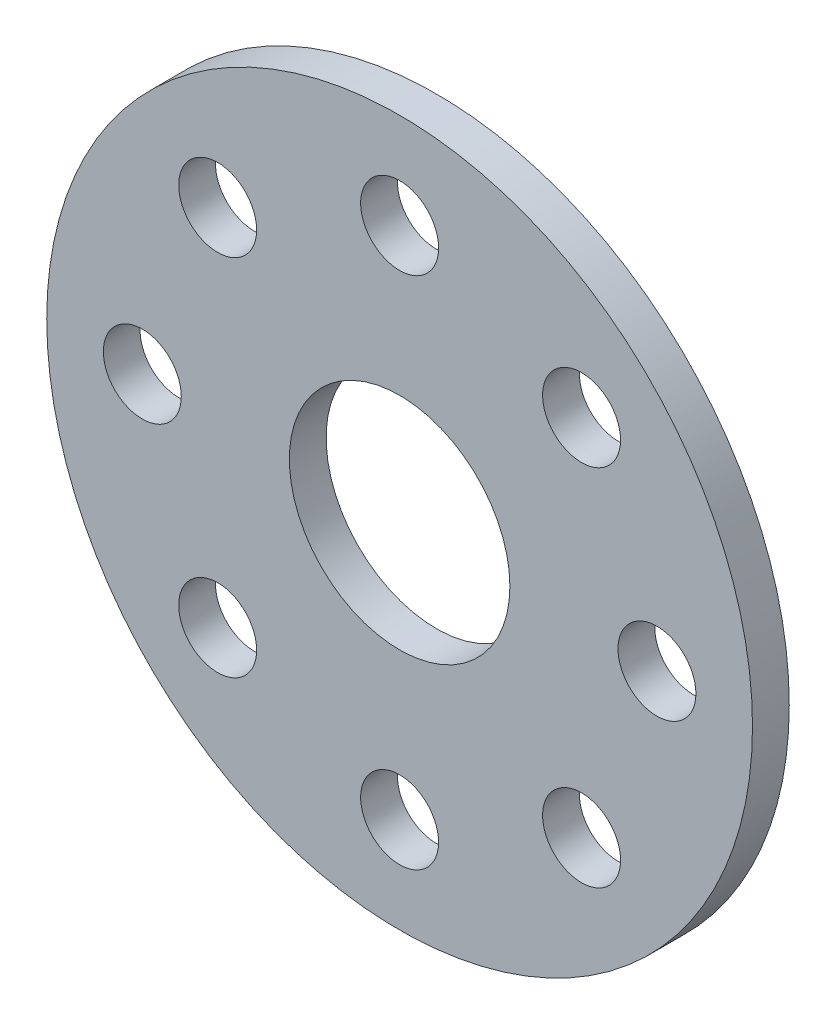
ISO-10303-21;
HEADER;
FILE_DESCRIPTION(('STEP AP214'),'2;1');
FILE_NAME('part.step','',(''),(''),'','','');
FILE_SCHEMA(('AUTOMOTIVE_DESIGN { 1 0 10303 214 1 1 1 1 }'));
ENDSEC;
DATA;
#1=APPLICATION_CONTEXT('core data for automotive mechanical design processes');
#2=APPLICATION_PROTOCOL_DEFINITION('international standard','automotive_design',2000,#1);
#3=PRODUCT_CONTEXT('',#1,'mechanical');
#4=PRODUCT('Part','Part','',(#3));
#5=PRODUCT_RELATED_PRODUCT_CATEGORY('part','',(#4));
#6=PRODUCT_DEFINITION_FORMATION('','',#4);
#7=PRODUCT_DEFINITION_CONTEXT('part definition',#1,'design');
#8=PRODUCT_DEFINITION('design','',#6,#7);
#9=PRODUCT_DEFINITION_SHAPE('','',#8);
#10=(LENGTH_UNIT() NAMED_UNIT(*) SI_UNIT(.MILLI.,.METRE.));
#11=(NAMED_UNIT(*) PLANE_ANGLE_UNIT() SI_UNIT($,.RADIAN.));
#12=(NAMED_UNIT(*) SI_UNIT($,.STERADIAN.) SOLID_ANGLE_UNIT());
#13=UNCERTAINTY_MEASURE_WITH_UNIT(LENGTH_MEASURE(1.E-05),#10,'distance_accuracy_value','');
#14=(GEOMETRIC_REPRESENTATION_CONTEXT(3) GLOBAL_UNCERTAINTY_ASSIGNED_CONTEXT((#13)) GLOBAL_UNIT_ASSIGNED_CONTEXT((#10,
#11,#12)) REPRESENTATION_CONTEXT('',''));
#15=CARTESIAN_POINT('',(0.,0.,0.));
#16=DIRECTION('',(0.,0.,1.));
#17=DIRECTION('',(1.,0.,0.));
#18=AXIS2_PLACEMENT_3D('',#15,#16,#17);
#19=CARTESIAN_POINT('',(0.,0.,1.25));
#20=DIRECTION('',(0.,0.,1.));
#21=DIRECTION('',(1.,0.,0.));
#22=AXIS2_PLACEMENT_3D('',#19,#20,#21);
#23=PLANE('',#22);
#24=CARTESIAN_POINT('',(0.,-17.5,1.25));
#25=DIRECTION('',(0.,0.,1.));
#26=DIRECTION('',(1.,0.,0.));
#27=AXIS2_PLACEMENT_3D('',#24,#25,#26);
#28=CIRCLE('',#27,2.65);
#29=CARTESIAN_POINT('',(2.65,-17.5,1.25));
#30=VERTEX_POINT('',#29);
#31=EDGE_CURVE('E93',#30,#30,#28,.T.);
#32=ORIENTED_EDGE('',*,*,#31,.F.);
#33=EDGE_LOOP('',(#32));
#34=FACE_BOUND('',#33,.T.);
#35=CARTESIAN_POINT('',(-12.3743686707646,-12.3743686707646,1.25));
#36=DIRECTION('',(0.,0.,1.));
#37=DIRECTION('',(1.,0.,0.));
#38=AXIS2_PLACEMENT_3D('',#35,#36,#37);
#39=CIRCLE('',#38,2.65);
#40=CARTESIAN_POINT('',(-9.72436867076459,-12.3743686707646,1.25));
#41=VERTEX_POINT('',#40);
#42=EDGE_CURVE('E87',#41,#41,#39,.T.);
#43=ORIENTED_EDGE('',*,*,#42,.F.);
#44=EDGE_LOOP('',(#43));
#45=FACE_BOUND('',#44,.T.);
#46=CARTESIAN_POINT('',(-17.5,0.,1.25));
#47=DIRECTION('',(0.,0.,1.));
#48=DIRECTION('',(1.,0.,0.));
#49=AXIS2_PLACEMENT_3D('',#46,#47,#48);
#50=CIRCLE('',#49,2.65);
#51=CARTESIAN_POINT('',(-14.85,0.,1.25));
#52=VERTEX_POINT('',#51);
#53=EDGE_CURVE('E81',#52,#52,#50,.T.);
#54=ORIENTED_EDGE('',*,*,#53,.F.);
#55=EDGE_LOOP('',(#54));
#56=FACE_BOUND('',#55,.T.);
#57=CARTESIAN_POINT('',(-12.3743686707646,12.3743686707646,1.25));
#58=DIRECTION('',(0.,0.,1.));
#59=DIRECTION('',(1.,0.,0.));
#60=AXIS2_PLACEMENT_3D('',#57,#58,#59);
#61=CIRCLE('',#60,2.65);
#62=CARTESIAN_POINT('',(-9.72436867076458,12.3743686707646,1.25));
#63=VERTEX_POINT('',#62);
#64=EDGE_CURVE('E75',#63,#63,#61,.T.);
#65=ORIENTED_EDGE('',*,*,#64,.F.);
#66=EDGE_LOOP('',(#65));
#67=FACE_BOUND('',#66,.T.);
#68=CARTESIAN_POINT('',(0.,17.5,1.25));
#69=DIRECTION('',(0.,0.,1.));
#70=DIRECTION('',(1.,0.,0.));
#71=AXIS2_PLACEMENT_3D('',#68,#69,#70);
#72=CIRCLE('',#71,2.65);
#73=CARTESIAN_POINT('',(2.65000000000001,17.5,1.25));
#74=VERTEX_POINT('',#73);
#75=EDGE_CURVE('E69',#74,#74,#72,.T.);
#76=ORIENTED_EDGE('',*,*,#75,.F.);
#77=EDGE_LOOP('',(#76));
#78=FACE_BOUND('',#77,.T.);
#79=CARTESIAN_POINT('',(12.3743686707646,12.3743686707646,1.25));
#80=DIRECTION('',(0.,0.,1.));
#81=DIRECTION('',(1.,0.,0.));
#82=AXIS2_PLACEMENT_3D('',#79,#80,#81);
#83=CIRCLE('',#82,2.65);
#84=CARTESIAN_POINT('',(15.0243686707646,12.3743686707646,1.25));
#85=VERTEX_POINT('',#84);
#86=EDGE_CURVE('E63',#85,#85,#83,.T.);
#87=ORIENTED_EDGE('',*,*,#86,.F.);
#88=EDGE_LOOP('',(#87));
#89=FACE_BOUND('',#88,.T.);
#90=CARTESIAN_POINT('',(17.5,0.,1.25));
#91=DIRECTION('',(0.,0.,1.));
#92=DIRECTION('',(1.,0.,0.));
#93=AXIS2_PLACEMENT_3D('',#90,#91,#92);
#94=CIRCLE('',#93,2.65);
#95=CARTESIAN_POINT('',(20.15,0.,1.25));
#96=VERTEX_POINT('',#95);
#97=EDGE_CURVE('E57',#96,#96,#94,.T.);
#98=ORIENTED_EDGE('',*,*,#97,.F.);
#99=EDGE_LOOP('',(#98));
#100=FACE_BOUND('',#99,.T.);
#101=CARTESIAN_POINT('',(12.3743686707646,-12.3743686707646,1.25));
#102=DIRECTION('',(0.,0.,1.));
#103=DIRECTION('',(1.,0.,0.));
#104=AXIS2_PLACEMENT_3D('',#101,#102,#103);
#105=CIRCLE('',#104,2.65);
#106=CARTESIAN_POINT('',(15.0243686707646,-12.3743686707646,1.25));
#107=VERTEX_POINT('',#106);
#108=EDGE_CURVE('E51',#107,#107,#105,.T.);
#109=ORIENTED_EDGE('',*,*,#108,.F.);
#110=EDGE_LOOP('',(#109));
#111=FACE_BOUND('',#110,.T.);
#112=CARTESIAN_POINT('',(0.,0.,1.25));
#113=DIRECTION('',(0.,0.,1.));
#114=DIRECTION('',(1.,0.,0.));
#115=AXIS2_PLACEMENT_3D('',#112,#113,#114);
#116=CIRCLE('',#115,24.);
#117=CARTESIAN_POINT('',(24.,0.,1.25));
#118=VERTEX_POINT('',#117);
#119=EDGE_CURVE('E10',#118,#118,#116,.T.);
#120=ORIENTED_EDGE('',*,*,#119,.T.);
#121=EDGE_LOOP('',(#120));
#122=FACE_BOUND('',#121,.T.);
#123=CARTESIAN_POINT('',(0.,0.,1.25));
#124=DIRECTION('',(0.,0.,1.));
#125=DIRECTION('',(1.,0.,0.));
#126=AXIS2_PLACEMENT_3D('',#123,#124,#125);
#127=CIRCLE('',#126,7.5);
#128=CARTESIAN_POINT('',(7.5,0.,1.25));
#129=VERTEX_POINT('',#128);
#130=EDGE_CURVE('E41',#129,#129,#127,.T.);
#131=ORIENTED_EDGE('',*,*,#130,.F.);
#132=EDGE_LOOP('',(#131));
#133=FACE_BOUND('',#132,.T.);
#134=ADVANCED_FACE('F30',(#34,#45,#56,#67,#78,#89,#100,#111,#122,#133),#23,.T.);
#135=CARTESIAN_POINT('',(0.,0.,-1.25));
#136=DIRECTION('',(0.,0.,1.));
#137=DIRECTION('',(1.,0.,0.));
#138=AXIS2_PLACEMENT_3D('',#135,#136,#137);
#139=PLANE('',#138);
#140=CARTESIAN_POINT('',(0.,-17.5,-1.25));
#141=DIRECTION('',(0.,0.,1.));
#142=DIRECTION('',(1.,0.,0.));
#143=AXIS2_PLACEMENT_3D('',#140,#141,#142);
#144=CIRCLE('',#143,2.65);
#145=CARTESIAN_POINT('',(2.65,-17.5,-1.25));
#146=VERTEX_POINT('',#145);
#147=EDGE_CURVE('E90',#146,#146,#144,.T.);
#148=ORIENTED_EDGE('',*,*,#147,.T.);
#149=EDGE_LOOP('',(#148));
#150=FACE_BOUND('',#149,.T.);
#151=CARTESIAN_POINT('',(-12.3743686707646,-12.3743686707646,-1.25));
#152=DIRECTION('',(0.,0.,1.));
#153=DIRECTION('',(1.,0.,0.));
#154=AXIS2_PLACEMENT_3D('',#151,#152,#153);
#155=CIRCLE('',#154,2.65);
#156=CARTESIAN_POINT('',(-9.72436867076459,-12.3743686707646,-1.25));
#157=VERTEX_POINT('',#156);
#158=EDGE_CURVE('E84',#157,#157,#155,.T.);
#159=ORIENTED_EDGE('',*,*,#158,.T.);
#160=EDGE_LOOP('',(#159));
#161=FACE_BOUND('',#160,.T.);
#162=CARTESIAN_POINT('',(-17.5,0.,-1.25));
#163=DIRECTION('',(0.,0.,1.));
#164=DIRECTION('',(1.,0.,0.));
#165=AXIS2_PLACEMENT_3D('',#162,#163,#164);
#166=CIRCLE('',#165,2.65);
#167=CARTESIAN_POINT('',(-14.85,0.,-1.25));
#168=VERTEX_POINT('',#167);
#169=EDGE_CURVE('E78',#168,#168,#166,.T.);
#170=ORIENTED_EDGE('',*,*,#169,.T.);
#171=EDGE_LOOP('',(#170));
#172=FACE_BOUND('',#171,.T.);
#173=CARTESIAN_POINT('',(-12.3743686707646,12.3743686707646,-1.25));
#174=DIRECTION('',(0.,0.,1.));
#175=DIRECTION('',(1.,0.,0.));
#176=AXIS2_PLACEMENT_3D('',#173,#174,#175);
#177=CIRCLE('',#176,2.65);
#178=CARTESIAN_POINT('',(-9.72436867076458,12.3743686707646,-1.25));
#179=VERTEX_POINT('',#178);
#180=EDGE_CURVE('E72',#179,#179,#177,.T.);
#181=ORIENTED_EDGE('',*,*,#180,.T.);
#182=EDGE_LOOP('',(#181));
#183=FACE_BOUND('',#182,.T.);
#184=CARTESIAN_POINT('',(0.,17.5,-1.25));
#185=DIRECTION('',(0.,0.,1.));
#186=DIRECTION('',(1.,0.,0.));
#187=AXIS2_PLACEMENT_3D('',#184,#185,#186);
#188=CIRCLE('',#187,2.65);
#189=CARTESIAN_POINT('',(2.65000000000001,17.5,-1.25));
#190=VERTEX_POINT('',#189);
#191=EDGE_CURVE('E66',#190,#190,#188,.T.);
#192=ORIENTED_EDGE('',*,*,#191,.T.);
#193=EDGE_LOOP('',(#192));
#194=FACE_BOUND('',#193,.T.);
#195=CARTESIAN_POINT('',(12.3743686707646,12.3743686707646,-1.25));
#196=DIRECTION('',(0.,0.,1.));
#197=DIRECTION('',(1.,0.,0.));
#198=AXIS2_PLACEMENT_3D('',#195,#196,#197);
#199=CIRCLE('',#198,2.65);
#200=CARTESIAN_POINT('',(15.0243686707646,12.3743686707646,-1.25));
#201=VERTEX_POINT('',#200);
#202=EDGE_CURVE('E60',#201,#201,#199,.T.);
#203=ORIENTED_EDGE('',*,*,#202,.T.);
#204=EDGE_LOOP('',(#203));
#205=FACE_BOUND('',#204,.T.);
#206=CARTESIAN_POINT('',(17.5,0.,-1.25));
#207=DIRECTION('',(0.,0.,1.));
#208=DIRECTION('',(1.,0.,0.));
#209=AXIS2_PLACEMENT_3D('',#206,#207,#208);
#210=CIRCLE('',#209,2.65);
#211=CARTESIAN_POINT('',(20.15,0.,-1.25));
#212=VERTEX_POINT('',#211);
#213=EDGE_CURVE('E54',#212,#212,#210,.T.);
#214=ORIENTED_EDGE('',*,*,#213,.T.);
#215=EDGE_LOOP('',(#214));
#216=FACE_BOUND('',#215,.T.);
#217=CARTESIAN_POINT('',(12.3743686707646,-12.3743686707646,-1.25));
#218=DIRECTION('',(0.,0.,1.));
#219=DIRECTION('',(1.,0.,0.));
#220=AXIS2_PLACEMENT_3D('',#217,#218,#219);
#221=CIRCLE('',#220,2.65);
#222=CARTESIAN_POINT('',(15.0243686707646,-12.3743686707646,-1.25));
#223=VERTEX_POINT('',#222);
#224=EDGE_CURVE('E46',#223,#223,#221,.T.);
#225=ORIENTED_EDGE('',*,*,#224,.T.);
#226=EDGE_LOOP('',(#225));
#227=FACE_BOUND('',#226,.T.);
#228=CARTESIAN_POINT('',(0.,0.,-1.25));
#229=DIRECTION('',(0.,0.,1.));
#230=DIRECTION('',(1.,0.,0.));
#231=AXIS2_PLACEMENT_3D('',#228,#229,#230);
#232=CIRCLE('',#231,24.);
#233=CARTESIAN_POINT('',(24.,0.,-1.25));
#234=VERTEX_POINT('',#233);
#235=EDGE_CURVE('E34',#234,#234,#232,.T.);
#236=ORIENTED_EDGE('',*,*,#235,.F.);
#237=EDGE_LOOP('',(#236));
#238=FACE_BOUND('',#237,.T.);
#239=CARTESIAN_POINT('',(0.,0.,-1.25));
#240=DIRECTION('',(0.,0.,1.));
#241=DIRECTION('',(1.,0.,0.));
#242=AXIS2_PLACEMENT_3D('',#239,#240,#241);
#243=CIRCLE('',#242,7.5);
#244=CARTESIAN_POINT('',(7.5,0.,-1.25));
#245=VERTEX_POINT('',#244);
#246=EDGE_CURVE('E43',#245,#245,#243,.T.);
#247=ORIENTED_EDGE('',*,*,#246,.T.);
#248=EDGE_LOOP('',(#247));
#249=FACE_BOUND('',#248,.T.);
#250=ADVANCED_FACE('F101',(#150,#161,#172,#183,#194,#205,#216,#227,#238,#249),#139,.F.);
#251=CARTESIAN_POINT('',(0.,0.,1.25));
#252=DIRECTION('',(0.,0.,-1.));
#253=DIRECTION('',(-1.,0.,0.));
#254=AXIS2_PLACEMENT_3D('',#251,#252,#253);
#255=CYLINDRICAL_SURFACE('',#254,24.);
#256=ORIENTED_EDGE('',*,*,#119,.F.);
#257=EDGE_LOOP('',(#256));
#258=FACE_BOUND('',#257,.T.);
#259=ORIENTED_EDGE('',*,*,#235,.T.);
#260=EDGE_LOOP('',(#259));
#261=FACE_BOUND('',#260,.T.);
#262=ADVANCED_FACE('F32',(#258,#261),#255,.T.);
#263=CARTESIAN_POINT('',(0.,0.,1.25));
#264=DIRECTION('',(0.,0.,-1.));
#265=DIRECTION('',(-1.,0.,0.));
#266=AXIS2_PLACEMENT_3D('',#263,#264,#265);
#267=CYLINDRICAL_SURFACE('',#266,7.5);
#268=ORIENTED_EDGE('',*,*,#130,.T.);
#269=EDGE_LOOP('',(#268));
#270=FACE_BOUND('',#269,.T.);
#271=ORIENTED_EDGE('',*,*,#246,.F.);
#272=EDGE_LOOP('',(#271));
#273=FACE_BOUND('',#272,.T.);
#274=ADVANCED_FACE('F119',(#270,#273),#267,.F.);
#275=CARTESIAN_POINT('',(12.3743686707646,-12.3743686707646,1.25));
#276=DIRECTION('',(0.,0.,1.));
#277=DIRECTION('',(1.,0.,0.));
#278=AXIS2_PLACEMENT_3D('',#275,#276,#277);
#279=CYLINDRICAL_SURFACE('',#278,2.65);
#280=ORIENTED_EDGE('',*,*,#224,.F.);
#281=EDGE_LOOP('',(#280));
#282=FACE_BOUND('',#281,.T.);
#283=ORIENTED_EDGE('',*,*,#108,.T.);
#284=EDGE_LOOP('',(#283));
#285=FACE_BOUND('',#284,.T.);
#286=ADVANCED_FACE('F122',(#282,#285),#279,.F.);
#287=CARTESIAN_POINT('',(17.5,0.,1.25));
#288=DIRECTION('',(0.,0.,1.));
#289=DIRECTION('',(1.,0.,0.));
#290=AXIS2_PLACEMENT_3D('',#287,#288,#289);
#291=CYLINDRICAL_SURFACE('',#290,2.65);
#292=ORIENTED_EDGE('',*,*,#213,.F.);
#293=EDGE_LOOP('',(#292));
#294=FACE_BOUND('',#293,.T.);
#295=ORIENTED_EDGE('',*,*,#97,.T.);
#296=EDGE_LOOP('',(#295));
#297=FACE_BOUND('',#296,.T.);
#298=ADVANCED_FACE('F136',(#294,#297),#291,.F.);
#299=CARTESIAN_POINT('',(12.3743686707646,12.3743686707646,1.25));
#300=DIRECTION('',(0.,0.,1.));
#301=DIRECTION('',(1.,0.,0.));
#302=AXIS2_PLACEMENT_3D('',#299,#300,#301);
#303=CYLINDRICAL_SURFACE('',#302,2.65);
#304=ORIENTED_EDGE('',*,*,#202,.F.);
#305=EDGE_LOOP('',(#304));
#306=FACE_BOUND('',#305,.T.);
#307=ORIENTED_EDGE('',*,*,#86,.T.);
#308=EDGE_LOOP('',(#307));
#309=FACE_BOUND('',#308,.T.);
#310=ADVANCED_FACE('F140',(#306,#309),#303,.F.);
#311=CARTESIAN_POINT('',(0.,17.5,1.25));
#312=DIRECTION('',(0.,0.,1.));
#313=DIRECTION('',(1.,0.,0.));
#314=AXIS2_PLACEMENT_3D('',#311,#312,#313);
#315=CYLINDRICAL_SURFACE('',#314,2.65);
#316=ORIENTED_EDGE('',*,*,#191,.F.);
#317=EDGE_LOOP('',(#316));
#318=FACE_BOUND('',#317,.T.);
#319=ORIENTED_EDGE('',*,*,#75,.T.);
#320=EDGE_LOOP('',(#319));
#321=FACE_BOUND('',#320,.T.);
#322=ADVANCED_FACE('F144',(#318,#321),#315,.F.);
#323=CARTESIAN_POINT('',(-12.3743686707646,12.3743686707646,1.25));
#324=DIRECTION('',(0.,0.,1.));
#325=DIRECTION('',(1.,0.,0.));
#326=AXIS2_PLACEMENT_3D('',#323,#324,#325);
#327=CYLINDRICAL_SURFACE('',#326,2.65);
#328=ORIENTED_EDGE('',*,*,#180,.F.);
#329=EDGE_LOOP('',(#328));
#330=FACE_BOUND('',#329,.T.);
#331=ORIENTED_EDGE('',*,*,#64,.T.);
#332=EDGE_LOOP('',(#331));
#333=FACE_BOUND('',#332,.T.);
#334=ADVANCED_FACE('F148',(#330,#333),#327,.F.);
#335=CARTESIAN_POINT('',(-17.5,0.,1.25));
#336=DIRECTION('',(0.,0.,1.));
#337=DIRECTION('',(1.,0.,0.));
#338=AXIS2_PLACEMENT_3D('',#335,#336,#337);
#339=CYLINDRICAL_SURFACE('',#338,2.65);
#340=ORIENTED_EDGE('',*,*,#169,.F.);
#341=EDGE_LOOP('',(#340));
#342=FACE_BOUND('',#341,.T.);
#343=ORIENTED_EDGE('',*,*,#53,.T.);
#344=EDGE_LOOP('',(#343));
#345=FACE_BOUND('',#344,.T.);
#346=ADVANCED_FACE('F152',(#342,#345),#339,.F.);
#347=CARTESIAN_POINT('',(-12.3743686707646,-12.3743686707646,1.25));
#348=DIRECTION('',(0.,0.,1.));
#349=DIRECTION('',(1.,0.,0.));
#350=AXIS2_PLACEMENT_3D('',#347,#348,#349);
#351=CYLINDRICAL_SURFACE('',#350,2.65);
#352=ORIENTED_EDGE('',*,*,#158,.F.);
#353=EDGE_LOOP('',(#352));
#354=FACE_BOUND('',#353,.T.);
#355=ORIENTED_EDGE('',*,*,#42,.T.);
#356=EDGE_LOOP('',(#355));
#357=FACE_BOUND('',#356,.T.);
#358=ADVANCED_FACE('F156',(#354,#357),#351,.F.);
#359=CARTESIAN_POINT('',(0.,-17.5,1.25));
#360=DIRECTION('',(0.,0.,1.));
#361=DIRECTION('',(1.,0.,0.));
#362=AXIS2_PLACEMENT_3D('',#359,#360,#361);
#363=CYLINDRICAL_SURFACE('',#362,2.65);
#364=ORIENTED_EDGE('',*,*,#147,.F.);
#365=EDGE_LOOP('',(#364));
#366=FACE_BOUND('',#365,.T.);
#367=ORIENTED_EDGE('',*,*,#31,.T.);
#368=EDGE_LOOP('',(#367));
#369=FACE_BOUND('',#368,.T.);
#370=ADVANCED_FACE('F97',(#366,#369),#363,.F.);
#371=CLOSED_SHELL('',(#134,#250,#262,#274,#286,#298,#310,#322,#334,#346,#358,#370));
#372=MANIFOLD_SOLID_BREP('B2',#371);
#373=ADVANCED_BREP_SHAPE_REPRESENTATION('',(#18,#372),#14);
#374=SHAPE_DEFINITION_REPRESENTATION(#9,#373);
ENDSEC;
END-ISO-10303-21;
